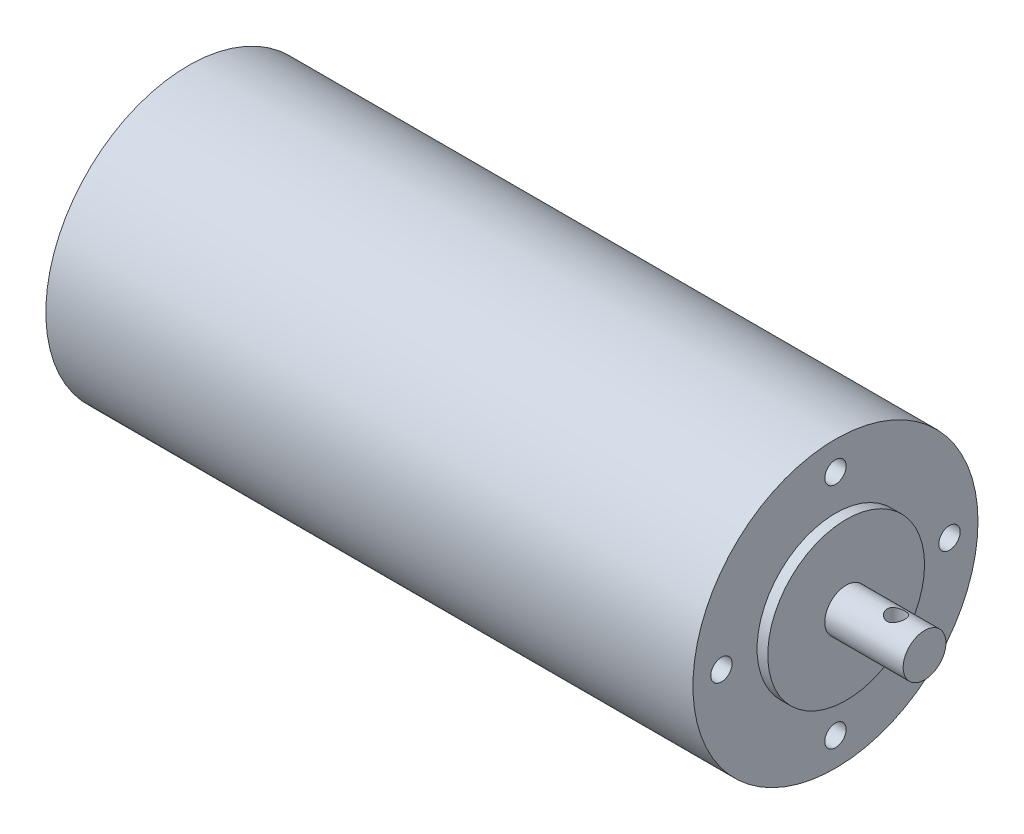
ISO-10303-21;
HEADER;
FILE_DESCRIPTION(('STEP AP214'),'2;1');
FILE_NAME('part.step','',(''),(''),'','','');
FILE_SCHEMA(('AUTOMOTIVE_DESIGN { 1 0 10303 214 1 1 1 1 }'));
ENDSEC;
DATA;
#1=APPLICATION_CONTEXT('core data for automotive mechanical design processes');
#2=APPLICATION_PROTOCOL_DEFINITION('international standard','automotive_design',2000,#1);
#3=PRODUCT_CONTEXT('',#1,'mechanical');
#4=PRODUCT('Part','Part','',(#3));
#5=PRODUCT_RELATED_PRODUCT_CATEGORY('part','',(#4));
#6=PRODUCT_DEFINITION_FORMATION('','',#4);
#7=PRODUCT_DEFINITION_CONTEXT('part definition',#1,'design');
#8=PRODUCT_DEFINITION('design','',#6,#7);
#9=PRODUCT_DEFINITION_SHAPE('','',#8);
#10=(LENGTH_UNIT() NAMED_UNIT(*) SI_UNIT(.MILLI.,.METRE.));
#11=(NAMED_UNIT(*) PLANE_ANGLE_UNIT() SI_UNIT($,.RADIAN.));
#12=(NAMED_UNIT(*) SI_UNIT($,.STERADIAN.) SOLID_ANGLE_UNIT());
#13=UNCERTAINTY_MEASURE_WITH_UNIT(LENGTH_MEASURE(1.E-05),#10,'distance_accuracy_value','');
#14=(GEOMETRIC_REPRESENTATION_CONTEXT(3) GLOBAL_UNCERTAINTY_ASSIGNED_CONTEXT((#13)) GLOBAL_UNIT_ASSIGNED_CONTEXT((#10,
#11,#12)) REPRESENTATION_CONTEXT('',''));
#15=CARTESIAN_POINT('',(0.,0.,0.));
#16=DIRECTION('',(0.,0.,1.));
#17=DIRECTION('',(1.,0.,0.));
#18=AXIS2_PLACEMENT_3D('',#15,#16,#17);
#19=CARTESIAN_POINT('',(90.8,0.,0.));
#20=DIRECTION('',(-1.,0.,0.));
#21=DIRECTION('',(0.,0.,1.));
#22=AXIS2_PLACEMENT_3D('',#19,#20,#21);
#23=CYLINDRICAL_SURFACE('',#22,20.);
#24=CARTESIAN_POINT('',(90.8,0.,0.));
#25=DIRECTION('',(1.,0.,0.));
#26=DIRECTION('',(0.,0.,-1.));
#27=AXIS2_PLACEMENT_3D('',#24,#25,#26);
#28=CIRCLE('',#27,20.);
#29=CARTESIAN_POINT('',(90.8,0.,-20.));
#30=VERTEX_POINT('',#29);
#31=EDGE_CURVE('E53',#30,#30,#28,.T.);
#32=ORIENTED_EDGE('',*,*,#31,.F.);
#33=EDGE_LOOP('',(#32));
#34=FACE_BOUND('',#33,.T.);
#35=CARTESIAN_POINT('',(0.,0.,0.));
#36=DIRECTION('',(1.,0.,0.));
#37=DIRECTION('',(0.,0.,-1.));
#38=AXIS2_PLACEMENT_3D('',#35,#36,#37);
#39=CIRCLE('',#38,20.);
#40=CARTESIAN_POINT('',(0.,0.,-20.));
#41=VERTEX_POINT('',#40);
#42=EDGE_CURVE('E58',#41,#41,#39,.T.);
#43=ORIENTED_EDGE('',*,*,#42,.T.);
#44=EDGE_LOOP('',(#43));
#45=FACE_BOUND('',#44,.T.);
#46=ADVANCED_FACE('F41',(#34,#45),#23,.T.);
#47=CARTESIAN_POINT('',(90.8,0.,0.));
#48=DIRECTION('',(1.,0.,0.));
#49=DIRECTION('',(0.,0.,-1.));
#50=AXIS2_PLACEMENT_3D('',#47,#48,#49);
#51=PLANE('',#50);
#52=CARTESIAN_POINT('',(90.8,16.,0.));
#53=DIRECTION('',(1.,0.,0.));
#54=DIRECTION('',(0.,0.,-1.));
#55=AXIS2_PLACEMENT_3D('',#52,#53,#54);
#56=CIRCLE('',#55,1.5);
#57=CARTESIAN_POINT('',(90.8,16.,-1.5));
#58=VERTEX_POINT('',#57);
#59=EDGE_CURVE('E148',#58,#58,#56,.T.);
#60=ORIENTED_EDGE('',*,*,#59,.F.);
#61=EDGE_LOOP('',(#60));
#62=FACE_BOUND('',#61,.T.);
#63=CARTESIAN_POINT('',(90.8,4.5180819856851E-13,-16.0000000000005));
#64=DIRECTION('',(1.,0.,0.));
#65=DIRECTION('',(0.,0.,-1.));
#66=AXIS2_PLACEMENT_3D('',#63,#64,#65);
#67=CIRCLE('',#66,1.50000000000035);
#68=CARTESIAN_POINT('',(90.8,4.5180819856851E-13,-17.5000000000008));
#69=VERTEX_POINT('',#68);
#70=EDGE_CURVE('E152',#69,#69,#67,.T.);
#71=ORIENTED_EDGE('',*,*,#70,.F.);
#72=EDGE_LOOP('',(#71));
#73=FACE_BOUND('',#72,.T.);
#74=CARTESIAN_POINT('',(90.8,-16.,-9.03616397137021E-13));
#75=DIRECTION('',(1.,0.,0.));
#76=DIRECTION('',(0.,0.,-1.));
#77=AXIS2_PLACEMENT_3D('',#74,#75,#76);
#78=CIRCLE('',#77,1.50000000000097);
#79=CARTESIAN_POINT('',(90.8,-16.,-1.50000000000187));
#80=VERTEX_POINT('',#79);
#81=EDGE_CURVE('E163',#80,#80,#78,.T.);
#82=ORIENTED_EDGE('',*,*,#81,.F.);
#83=EDGE_LOOP('',(#82));
#84=FACE_BOUND('',#83,.T.);
#85=CARTESIAN_POINT('',(90.8,-4.53767633447146E-13,15.9999999999995));
#86=DIRECTION('',(1.,0.,0.));
#87=DIRECTION('',(0.,0.,-1.));
#88=AXIS2_PLACEMENT_3D('',#85,#86,#87);
#89=CIRCLE('',#88,1.50000000000073);
#90=CARTESIAN_POINT('',(90.8,-4.53767633447146E-13,14.4999999999988));
#91=VERTEX_POINT('',#90);
#92=EDGE_CURVE('E169',#91,#91,#89,.T.);
#93=ORIENTED_EDGE('',*,*,#92,.F.);
#94=EDGE_LOOP('',(#93));
#95=FACE_BOUND('',#94,.T.);
#96=CARTESIAN_POINT('',(90.8,0.,0.));
#97=DIRECTION('',(1.,0.,0.));
#98=DIRECTION('',(0.,0.,-1.));
#99=AXIS2_PLACEMENT_3D('',#96,#97,#98);
#100=CIRCLE('',#99,11.);
#101=CARTESIAN_POINT('',(90.8,0.,-11.));
#102=VERTEX_POINT('',#101);
#103=EDGE_CURVE('E10',#102,#102,#100,.T.);
#104=ORIENTED_EDGE('',*,*,#103,.F.);
#105=EDGE_LOOP('',(#104));
#106=FACE_BOUND('',#105,.T.);
#107=ORIENTED_EDGE('',*,*,#31,.T.);
#108=EDGE_LOOP('',(#107));
#109=FACE_BOUND('',#108,.T.);
#110=ADVANCED_FACE('F90',(#62,#73,#84,#95,#106,#109),#51,.T.);
#111=CARTESIAN_POINT('',(0.,0.,0.));
#112=DIRECTION('',(1.,0.,0.));
#113=DIRECTION('',(0.,0.,-1.));
#114=AXIS2_PLACEMENT_3D('',#111,#112,#113);
#115=PLANE('',#114);
#116=ORIENTED_EDGE('',*,*,#42,.F.);
#117=EDGE_LOOP('',(#116));
#118=FACE_BOUND('',#117,.T.);
#119=ADVANCED_FACE('F95',(#118),#115,.F.);
#120=CARTESIAN_POINT('',(92.3,0.,0.));
#121=DIRECTION('',(-1.,0.,0.));
#122=DIRECTION('',(0.,0.,1.));
#123=AXIS2_PLACEMENT_3D('',#120,#121,#122);
#124=CYLINDRICAL_SURFACE('',#123,11.);
#125=CARTESIAN_POINT('',(92.3,0.,0.));
#126=DIRECTION('',(1.,0.,0.));
#127=DIRECTION('',(0.,0.,-1.));
#128=AXIS2_PLACEMENT_3D('',#125,#126,#127);
#129=CIRCLE('',#128,11.);
#130=CARTESIAN_POINT('',(92.3,0.,-11.));
#131=VERTEX_POINT('',#130);
#132=EDGE_CURVE('E61',#131,#131,#129,.T.);
#133=ORIENTED_EDGE('',*,*,#132,.F.);
#134=EDGE_LOOP('',(#133));
#135=FACE_BOUND('',#134,.T.);
#136=ORIENTED_EDGE('',*,*,#103,.T.);
#137=EDGE_LOOP('',(#136));
#138=FACE_BOUND('',#137,.T.);
#139=ADVANCED_FACE('F103',(#135,#138),#124,.T.);
#140=CARTESIAN_POINT('',(92.3,0.,0.));
#141=DIRECTION('',(1.,0.,0.));
#142=DIRECTION('',(0.,0.,-1.));
#143=AXIS2_PLACEMENT_3D('',#140,#141,#142);
#144=PLANE('',#143);
#145=ORIENTED_EDGE('',*,*,#132,.T.);
#146=EDGE_LOOP('',(#145));
#147=FACE_BOUND('',#146,.T.);
#148=CARTESIAN_POINT('',(92.3,0.,0.));
#149=DIRECTION('',(1.,0.,0.));
#150=DIRECTION('',(0.,0.,-1.));
#151=AXIS2_PLACEMENT_3D('',#148,#149,#150);
#152=CIRCLE('',#151,3.);
#153=CARTESIAN_POINT('',(92.3,0.,-3.));
#154=VERTEX_POINT('',#153);
#155=EDGE_CURVE('E70',#154,#154,#152,.T.);
#156=ORIENTED_EDGE('',*,*,#155,.F.);
#157=EDGE_LOOP('',(#156));
#158=FACE_BOUND('',#157,.T.);
#159=ADVANCED_FACE('F107',(#147,#158),#144,.T.);
#160=CARTESIAN_POINT('',(87.6,-4.53767633447146E-13,15.9999999999995));
#161=DIRECTION('',(1.,0.,0.));
#162=DIRECTION('',(0.,0.,-1.));
#163=AXIS2_PLACEMENT_3D('',#160,#161,#162);
#164=CYLINDRICAL_SURFACE('',#163,1.50000000000073);
#165=CARTESIAN_POINT('',(87.6,-4.53767633447146E-13,15.9999999999995));
#166=DIRECTION('',(1.,0.,0.));
#167=DIRECTION('',(0.,0.,-1.));
#168=AXIS2_PLACEMENT_3D('',#165,#166,#167);
#169=CIRCLE('',#168,1.50000000000073);
#170=CARTESIAN_POINT('',(87.6,-4.53767633447146E-13,14.4999999999988));
#171=VERTEX_POINT('',#170);
#172=EDGE_CURVE('E171',#171,#171,#169,.T.);
#173=ORIENTED_EDGE('',*,*,#172,.F.);
#174=EDGE_LOOP('',(#173));
#175=FACE_BOUND('',#174,.T.);
#176=ORIENTED_EDGE('',*,*,#92,.T.);
#177=EDGE_LOOP('',(#176));
#178=FACE_BOUND('',#177,.T.);
#179=ADVANCED_FACE('F113',(#175,#178),#164,.F.);
#180=CARTESIAN_POINT('',(87.6,-4.53767633447146E-13,15.9999999999995));
#181=DIRECTION('',(1.,0.,0.));
#182=DIRECTION('',(0.,0.,-1.));
#183=AXIS2_PLACEMENT_3D('',#180,#181,#182);
#184=PLANE('',#183);
#185=ORIENTED_EDGE('',*,*,#172,.T.);
#186=EDGE_LOOP('',(#185));
#187=FACE_BOUND('',#186,.T.);
#188=ADVANCED_FACE('F115',(#187),#184,.T.);
#189=CARTESIAN_POINT('',(87.6,-16.,-9.03616397137021E-13));
#190=DIRECTION('',(1.,0.,0.));
#191=DIRECTION('',(0.,0.,-1.));
#192=AXIS2_PLACEMENT_3D('',#189,#190,#191);
#193=CYLINDRICAL_SURFACE('',#192,1.50000000000097);
#194=CARTESIAN_POINT('',(87.6,-16.,-9.03616397137021E-13));
#195=DIRECTION('',(1.,0.,0.));
#196=DIRECTION('',(0.,0.,-1.));
#197=AXIS2_PLACEMENT_3D('',#194,#195,#196);
#198=CIRCLE('',#197,1.50000000000097);
#199=CARTESIAN_POINT('',(87.6,-16.,-1.50000000000187));
#200=VERTEX_POINT('',#199);
#201=EDGE_CURVE('E166',#200,#200,#198,.T.);
#202=ORIENTED_EDGE('',*,*,#201,.F.);
#203=EDGE_LOOP('',(#202));
#204=FACE_BOUND('',#203,.T.);
#205=ORIENTED_EDGE('',*,*,#81,.T.);
#206=EDGE_LOOP('',(#205));
#207=FACE_BOUND('',#206,.T.);
#208=ADVANCED_FACE('F118',(#204,#207),#193,.F.);
#209=CARTESIAN_POINT('',(87.6,-16.,-9.03616397137021E-13));
#210=DIRECTION('',(1.,0.,0.));
#211=DIRECTION('',(0.,0.,-1.));
#212=AXIS2_PLACEMENT_3D('',#209,#210,#211);
#213=PLANE('',#212);
#214=ORIENTED_EDGE('',*,*,#201,.T.);
#215=EDGE_LOOP('',(#214));
#216=FACE_BOUND('',#215,.T.);
#217=ADVANCED_FACE('F123',(#216),#213,.T.);
#218=CARTESIAN_POINT('',(87.6,4.5180819856851E-13,-16.0000000000005));
#219=DIRECTION('',(1.,0.,0.));
#220=DIRECTION('',(0.,0.,-1.));
#221=AXIS2_PLACEMENT_3D('',#218,#219,#220);
#222=CYLINDRICAL_SURFACE('',#221,1.50000000000035);
#223=CARTESIAN_POINT('',(87.6,4.5180819856851E-13,-16.0000000000005));
#224=DIRECTION('',(1.,0.,0.));
#225=DIRECTION('',(0.,0.,-1.));
#226=AXIS2_PLACEMENT_3D('',#223,#224,#225);
#227=CIRCLE('',#226,1.50000000000035);
#228=CARTESIAN_POINT('',(87.6,4.5180819856851E-13,-17.5000000000008));
#229=VERTEX_POINT('',#228);
#230=EDGE_CURVE('E160',#229,#229,#227,.T.);
#231=ORIENTED_EDGE('',*,*,#230,.F.);
#232=EDGE_LOOP('',(#231));
#233=FACE_BOUND('',#232,.T.);
#234=ORIENTED_EDGE('',*,*,#70,.T.);
#235=EDGE_LOOP('',(#234));
#236=FACE_BOUND('',#235,.T.);
#237=ADVANCED_FACE('F126',(#233,#236),#222,.F.);
#238=CARTESIAN_POINT('',(87.6,4.5180819856851E-13,-16.0000000000005));
#239=DIRECTION('',(1.,0.,0.));
#240=DIRECTION('',(0.,0.,-1.));
#241=AXIS2_PLACEMENT_3D('',#238,#239,#240);
#242=PLANE('',#241);
#243=ORIENTED_EDGE('',*,*,#230,.T.);
#244=EDGE_LOOP('',(#243));
#245=FACE_BOUND('',#244,.T.);
#246=ADVANCED_FACE('F131',(#245),#242,.T.);
#247=CARTESIAN_POINT('',(87.6,16.,0.));
#248=DIRECTION('',(1.,0.,0.));
#249=DIRECTION('',(0.,0.,-1.));
#250=AXIS2_PLACEMENT_3D('',#247,#248,#249);
#251=CYLINDRICAL_SURFACE('',#250,1.5);
#252=CARTESIAN_POINT('',(87.6,16.,0.));
#253=DIRECTION('',(1.,0.,0.));
#254=DIRECTION('',(0.,0.,-1.));
#255=AXIS2_PLACEMENT_3D('',#252,#253,#254);
#256=CIRCLE('',#255,1.5);
#257=CARTESIAN_POINT('',(87.6,16.,-1.5));
#258=VERTEX_POINT('',#257);
#259=EDGE_CURVE('E147',#258,#258,#256,.T.);
#260=ORIENTED_EDGE('',*,*,#259,.F.);
#261=EDGE_LOOP('',(#260));
#262=FACE_BOUND('',#261,.T.);
#263=ORIENTED_EDGE('',*,*,#59,.T.);
#264=EDGE_LOOP('',(#263));
#265=FACE_BOUND('',#264,.T.);
#266=ADVANCED_FACE('F134',(#262,#265),#251,.F.);
#267=CARTESIAN_POINT('',(87.6,16.,0.));
#268=DIRECTION('',(1.,0.,0.));
#269=DIRECTION('',(0.,0.,-1.));
#270=AXIS2_PLACEMENT_3D('',#267,#268,#269);
#271=PLANE('',#270);
#272=ORIENTED_EDGE('',*,*,#259,.T.);
#273=EDGE_LOOP('',(#272));
#274=FACE_BOUND('',#273,.T.);
#275=ADVANCED_FACE('F79',(#274),#271,.T.);
#276=CARTESIAN_POINT('',(99.3,10.,0.));
#277=DIRECTION('',(0.,-1.,0.));
#278=DIRECTION('',(0.,0.,-1.));
#279=AXIS2_PLACEMENT_3D('',#276,#277,#278);
#280=CYLINDRICAL_SURFACE('',#279,1.25);
#281=CARTESIAN_POINT('',(99.3,-2.72717802865893,-1.25));
#282=CARTESIAN_POINT('',(99.3666718908968,-2.72718519563219,-1.24999259066567));
#283=CARTESIAN_POINT('',(99.4334526568262,-2.729658595344,-1.24463203881503));
#284=CARTESIAN_POINT('',(99.5650869420571,-2.73923833650884,-1.22339678947784));
#285=CARTESIAN_POINT('',(99.6299347266752,-2.74635725824267,-1.20749354003276));
#286=CARTESIAN_POINT('',(99.7555611296911,-2.76426917574768,-1.16589988419451));
#287=CARTESIAN_POINT('',(99.816355163715,-2.77504717562616,-1.14024937431428));
#288=CARTESIAN_POINT('',(99.932759449578,-2.79904148565793,-1.08000637754463));
#289=CARTESIAN_POINT('',(99.9883709234331,-2.81225721880783,-1.04541600591532));
#290=CARTESIAN_POINT('',(100.096325724973,-2.84055762619857,-0.965973882676168));
#291=CARTESIAN_POINT('',(100.148307558744,-2.85570568079146,-0.920653238184409));
#292=CARTESIAN_POINT('',(100.244200222498,-2.88564295372227,-0.822021675745551));
#293=CARTESIAN_POINT('',(100.288107940613,-2.90043203180789,-0.768707691374007));
#294=CARTESIAN_POINT('',(100.368449530879,-2.92875537930613,-0.652763393797353));
#295=CARTESIAN_POINT('',(100.404476628032,-2.94220739975291,-0.589829293683663));
#296=CARTESIAN_POINT('',(100.465276020506,-2.96556519993426,-0.458132022362357));
#297=CARTESIAN_POINT('',(100.490053311964,-2.97547255347157,-0.389371454872128));
#298=CARTESIAN_POINT('',(100.526339458757,-2.99017521042367,-0.251768498025169));
#299=CARTESIAN_POINT('',(100.538471694902,-2.99520971127466,-0.183116576196083));
#300=CARTESIAN_POINT('',(100.55113764116,-3.00046828611204,-0.0445791803650088));
#301=CARTESIAN_POINT('',(100.551676055883,-3.00069431131015,0.0253057817645135));
#302=CARTESIAN_POINT('',(100.541465719067,-2.99645129133057,0.159792780112565));
#303=CARTESIAN_POINT('',(100.531401899474,-2.99226714648664,0.22445748860731));
#304=CARTESIAN_POINT('',(100.501446897362,-2.98006516750309,0.351082893931453));
#305=CARTESIAN_POINT('',(100.48155499037,-2.97204705074577,0.413043391054913));
#306=CARTESIAN_POINT('',(100.432271959105,-2.95279852414029,0.533638118077523));
#307=CARTESIAN_POINT('',(100.402740537129,-2.94152097126085,0.592207177074903));
#308=CARTESIAN_POINT('',(100.3351542433,-2.91685713989805,0.703711767281961));
#309=CARTESIAN_POINT('',(100.297096359155,-2.90347011666255,0.756645297756973));
#310=CARTESIAN_POINT('',(100.210417579595,-2.87481698777061,0.859340911707922));
#311=CARTESIAN_POINT('',(100.161241208721,-2.8594849435601,0.908616437316237));
#312=CARTESIAN_POINT('',(100.055288559293,-2.8293786068147,0.998431414927665));
#313=CARTESIAN_POINT('',(99.9985093617079,-2.8146045313137,1.03896749582431));
#314=CARTESIAN_POINT('',(99.8766049633381,-2.78681612355338,1.11140189250063));
#315=CARTESIAN_POINT('',(99.8112667942567,-2.77387558556714,1.1429725335554));
#316=CARTESIAN_POINT('',(99.6755189550255,-2.75209844221011,1.19446432058391));
#317=CARTESIAN_POINT('',(99.6051129517304,-2.74325890334594,1.21439379627313));
#318=CARTESIAN_POINT('',(99.466103191086,-2.73141212519724,1.24080025168121));
#319=CARTESIAN_POINT('',(99.397678877741,-2.72806369197117,1.24806614632866));
#320=CARTESIAN_POINT('',(99.2605215175885,-2.72660286810642,1.25125630518999));
#321=CARTESIAN_POINT('',(99.1917885858083,-2.72848866599319,1.24718449318149));
#322=CARTESIAN_POINT('',(99.0606016145695,-2.73693131345749,1.22853477565556));
#323=CARTESIAN_POINT('',(98.9980273132132,-2.74318138016617,1.21464618818049));
#324=CARTESIAN_POINT('',(98.8761487035021,-2.75925630297447,1.17767058564226));
#325=CARTESIAN_POINT('',(98.8168451631693,-2.76908199460161,1.15458142053125));
#326=CARTESIAN_POINT('',(98.7003846896435,-2.79170797857,1.09877520805186));
#327=CARTESIAN_POINT('',(98.6434250253897,-2.80461662202282,1.06569183306197));
#328=CARTESIAN_POINT('',(98.535591947501,-2.83180003740794,0.991200784385966));
#329=CARTESIAN_POINT('',(98.4847211832981,-2.84607539920583,0.949789507875985));
#330=CARTESIAN_POINT('',(98.386199865116,-2.87578619784532,0.855844455715504));
#331=CARTESIAN_POINT('',(98.3391486000493,-2.89122146708842,0.802679661479737));
#332=CARTESIAN_POINT('',(98.2545277080207,-2.92043361183923,0.688851512553539));
#333=CARTESIAN_POINT('',(98.2169587759363,-2.93421036577013,0.628187608803659));
#334=CARTESIAN_POINT('',(98.1524101245564,-2.9586425158565,0.50065468080339));
#335=CARTESIAN_POINT('',(98.1254577587105,-2.96928983138826,0.433770169638511));
#336=CARTESIAN_POINT('',(98.0833832076656,-2.98618173103366,0.295858835154421));
#337=CARTESIAN_POINT('',(98.0682539817739,-2.9924289351992,0.224834504225199));
#338=CARTESIAN_POINT('',(98.0511418744797,-2.9995153479751,0.0860165335064144));
#339=CARTESIAN_POINT('',(98.048314000303,-3.00070204534225,0.0183440847939007));
#340=CARTESIAN_POINT('',(98.0536131412939,-2.99849523480953,-0.116486811714282));
#341=CARTESIAN_POINT('',(98.0617382360129,-2.99510252984313,-0.183645347541151));
#342=CARTESIAN_POINT('',(98.0881060721587,-2.98430065981734,-0.313086482449179));
#343=CARTESIAN_POINT('',(98.1059796804695,-2.97703824209233,-0.375457537843563));
#344=CARTESIAN_POINT('',(98.1509342472091,-2.95929499847058,-0.496292230501325));
#345=CARTESIAN_POINT('',(98.1780169546649,-2.94881356124207,-0.554755122985821));
#346=CARTESIAN_POINT('',(98.2419895292145,-2.92505825398663,-0.669024565478777));
#347=CARTESIAN_POINT('',(98.279267301424,-2.91167959188766,-0.724591657976678));
#348=CARTESIAN_POINT('',(98.3620071828719,-2.88371561874231,-0.828918675638779));
#349=CARTESIAN_POINT('',(98.4074723304067,-2.86912986083797,-0.877676061786041));
#350=CARTESIAN_POINT('',(98.5089448258544,-2.83914845259141,-0.97044978723158));
#351=CARTESIAN_POINT('',(98.5654590146211,-2.82376522857896,-1.01391775364847));
#352=CARTESIAN_POINT('',(98.6854587406802,-2.79495552690186,-1.09083332306674));
#353=CARTESIAN_POINT('',(98.7489481480581,-2.78153014522558,-1.12427532456755));
#354=CARTESIAN_POINT('',(98.8809438350227,-2.75842557732643,-1.17982766043577));
#355=CARTESIAN_POINT('',(98.9494211587932,-2.74872654469865,-1.20199823632853));
#356=CARTESIAN_POINT('',(99.0895395738507,-2.73440803066668,-1.23423556453801));
#357=CARTESIAN_POINT('',(99.1611692072743,-2.72977151604981,-1.2443429152121));
#358=CARTESIAN_POINT('',(99.2553585242619,-2.72744979732688,-1.24940464923649));
#359=CARTESIAN_POINT('',(99.277673157388,-2.72717562860875,-1.25000248121118));
#360=CARTESIAN_POINT('',(99.3,-2.72717802865893,-1.25));
#361=B_SPLINE_CURVE_WITH_KNOTS('',3,(#281,#282,#283,#284,#285,#286,#287,#288,#289,#290,#291,
#292,#293,#294,#295,#296,#297,#298,#299,#300,#301,#302,#303,#304,#305,#306,#307,#308,#309,#310,
#311,#312,#313,#314,#315,#316,#317,#318,#319,#320,#321,#322,#323,#324,#325,#326,#327,#328,#329,
#330,#331,#332,#333,#334,#335,#336,#337,#338,#339,#340,#341,#342,#343,#344,#345,#346,#347,#348,
#349,#350,#351,#352,#353,#354,#355,#356,#357,#358,#359,#360),.UNSPECIFIED.,.T.,.F.,(4,2,2,2,2,2,
2,2,2,2,2,2,2,2,2,2,2,2,2,2,2,2,2,2,2,2,2,2,2,2,2,2,2,2,2,2,2,2,2,4),(0.,0.199951711985501,
0.400447161842173,0.600130652152093,0.799766938550099,1.01066841430654,1.22165100459909,
1.44178476577923,1.66182066774891,1.87040605977951,2.0789068091793,2.27471840245092,
2.47054443201883,2.66935814640065,2.86824221022483,3.08114531844484,3.29413040441367,
3.51411545666722,3.73394290745567,3.93950778306305,4.14500152518447,4.3373390106619,
4.5297214691353,4.73025126818169,4.93086800795466,5.14781662735513,5.36478114041866,
5.58230105955594,5.79969134643007,6.00188635094053,6.20404590801914,6.39903415036487,
6.59405944632172,6.79789862829037,7.00181361048903,7.21960426908077,7.43751638139188,
7.65425125796864,7.87025464546162,7.93721375436705),.UNSPECIFIED.);
#362=CARTESIAN_POINT('',(99.3,-2.72717802865893,-1.25));
#363=VERTEX_POINT('',#362);
#364=EDGE_CURVE('E65',#363,#363,#361,.T.);
#365=ORIENTED_EDGE('',*,*,#364,.T.);
#366=EDGE_LOOP('',(#365));
#367=FACE_BOUND('',#366,.T.);
#368=CARTESIAN_POINT('',(99.3,2.72717802865893,-1.25));
#369=CARTESIAN_POINT('',(99.2333281091031,2.72718519563219,-1.24999259066567));
#370=CARTESIAN_POINT('',(99.1665473431738,2.729658595344,-1.24463203881503));
#371=CARTESIAN_POINT('',(99.0349130579428,2.73923833650884,-1.22339678947784));
#372=CARTESIAN_POINT('',(98.9700652733248,2.74635725824267,-1.20749354003276));
#373=CARTESIAN_POINT('',(98.8444388703089,2.76426917574768,-1.1658998841945));
#374=CARTESIAN_POINT('',(98.783644836285,2.77504717562616,-1.14024937431428));
#375=CARTESIAN_POINT('',(98.6672405504219,2.79904148565793,-1.08000637754462));
#376=CARTESIAN_POINT('',(98.6116290765669,2.81225721880783,-1.04541600591531));
#377=CARTESIAN_POINT('',(98.5036742750265,2.84055762619857,-0.965973882676167));
#378=CARTESIAN_POINT('',(98.4516924412559,2.85570568079146,-0.920653238184409));
#379=CARTESIAN_POINT('',(98.3557997775024,2.88564295372227,-0.822021675745551));
#380=CARTESIAN_POINT('',(98.311892059387,2.90043203180789,-0.768707691374007));
#381=CARTESIAN_POINT('',(98.2315504691207,2.92875537930613,-0.652763393797353));
#382=CARTESIAN_POINT('',(98.1955233719676,2.94220739975291,-0.589829293683663));
#383=CARTESIAN_POINT('',(98.1347239794944,2.96556519993426,-0.458132022362357));
#384=CARTESIAN_POINT('',(98.1099466880358,2.97547255347157,-0.389371454872128));
#385=CARTESIAN_POINT('',(98.0736605412433,2.99017521042367,-0.251768498025168));
#386=CARTESIAN_POINT('',(98.0615283050979,2.99520971127466,-0.183116576196083));
#387=CARTESIAN_POINT('',(98.0488623588401,3.00046828611204,-0.044579180365008));
#388=CARTESIAN_POINT('',(98.048323944117,3.00069431131015,0.025305781764514));
#389=CARTESIAN_POINT('',(98.0585342809333,2.99645129133057,0.159792780112565));
#390=CARTESIAN_POINT('',(98.0685981005257,2.99226714648664,0.22445748860731));
#391=CARTESIAN_POINT('',(98.0985531026381,2.98006516750309,0.351082893931453));
#392=CARTESIAN_POINT('',(98.1184450096302,2.97204705074577,0.413043391054913));
#393=CARTESIAN_POINT('',(98.1677280408946,2.95279852414029,0.533638118077523));
#394=CARTESIAN_POINT('',(98.1972594628708,2.94152097126085,0.592207177074903));
#395=CARTESIAN_POINT('',(98.2648457567003,2.91685713989805,0.703711767281961));
#396=CARTESIAN_POINT('',(98.302903640845,2.90347011666255,0.756645297756973));
#397=CARTESIAN_POINT('',(98.3895824204046,2.87481698777061,0.859340911707922));
#398=CARTESIAN_POINT('',(98.438758791279,2.8594849435601,0.908616437316237));
#399=CARTESIAN_POINT('',(98.5447114407066,2.8293786068147,0.998431414927665));
#400=CARTESIAN_POINT('',(98.6014906382921,2.8146045313137,1.03896749582431));
#401=CARTESIAN_POINT('',(98.7233950366619,2.78681612355338,1.11140189250063));
#402=CARTESIAN_POINT('',(98.7887332057433,2.77387558556714,1.1429725335554));
#403=CARTESIAN_POINT('',(98.9244810449745,2.75209844221011,1.19446432058391));
#404=CARTESIAN_POINT('',(98.9948870482695,2.74325890334594,1.21439379627313));
#405=CARTESIAN_POINT('',(99.133896808914,2.73141212519724,1.24080025168121));
#406=CARTESIAN_POINT('',(99.202321122259,2.72806369197117,1.24806614632866));
#407=CARTESIAN_POINT('',(99.3394784824115,2.72660286810642,1.25125630518999));
#408=CARTESIAN_POINT('',(99.4082114141917,2.72848866599319,1.24718449318149));
#409=CARTESIAN_POINT('',(99.5393983854304,2.73693131345749,1.22853477565556));
#410=CARTESIAN_POINT('',(99.6019726867868,2.74318138016618,1.21464618818048));
#411=CARTESIAN_POINT('',(99.7238512964979,2.75925630297447,1.17767058564225));
#412=CARTESIAN_POINT('',(99.7831548368307,2.76908199460161,1.15458142053125));
#413=CARTESIAN_POINT('',(99.8996153103565,2.79170797857,1.09877520805186));
#414=CARTESIAN_POINT('',(99.9565749746103,2.80461662202282,1.06569183306198));
#415=CARTESIAN_POINT('',(100.064408052499,2.83180003740794,0.99120078438597));
#416=CARTESIAN_POINT('',(100.115278816702,2.84607539920583,0.949789507875988));
#417=CARTESIAN_POINT('',(100.213800134884,2.87578619784532,0.855844455715505));
#418=CARTESIAN_POINT('',(100.260851399951,2.89122146708842,0.802679661479737));
#419=CARTESIAN_POINT('',(100.345472291979,2.92043361183923,0.688851512553539));
#420=CARTESIAN_POINT('',(100.383041224064,2.93421036577013,0.628187608803659));
#421=CARTESIAN_POINT('',(100.447589875444,2.9586425158565,0.50065468080339));
#422=CARTESIAN_POINT('',(100.474542241289,2.96928983138826,0.433770169638511));
#423=CARTESIAN_POINT('',(100.516616792334,2.98618173103366,0.295858835154421));
#424=CARTESIAN_POINT('',(100.531746018226,2.9924289351992,0.224834504225199));
#425=CARTESIAN_POINT('',(100.54885812552,2.9995153479751,0.0860165335064144));
#426=CARTESIAN_POINT('',(100.551685999697,3.00070204534225,0.0183440847939007));
#427=CARTESIAN_POINT('',(100.546386858706,2.99849523480953,-0.116486811714282));
#428=CARTESIAN_POINT('',(100.538261763987,2.99510252984313,-0.183645347541151));
#429=CARTESIAN_POINT('',(100.511893927841,2.98430065981734,-0.313086482449179));
#430=CARTESIAN_POINT('',(100.49402031953,2.97703824209233,-0.375457537843563));
#431=CARTESIAN_POINT('',(100.449065752791,2.95929499847058,-0.496292230501325));
#432=CARTESIAN_POINT('',(100.421983045335,2.94881356124207,-0.554755122985821));
#433=CARTESIAN_POINT('',(100.358010470786,2.92505825398663,-0.669024565478777));
#434=CARTESIAN_POINT('',(100.320732698576,2.91167959188766,-0.724591657976678));
#435=CARTESIAN_POINT('',(100.237992817128,2.88371561874231,-0.828918675638779));
#436=CARTESIAN_POINT('',(100.192527669593,2.86912986083797,-0.877676061786041));
#437=CARTESIAN_POINT('',(100.091055174146,2.83914845259141,-0.97044978723158));
#438=CARTESIAN_POINT('',(100.034540985379,2.82376522857896,-1.01391775364847));
#439=CARTESIAN_POINT('',(99.9145412593198,2.79495552690186,-1.09083332306674));
#440=CARTESIAN_POINT('',(99.8510518519418,2.78153014522558,-1.12427532456755));
#441=CARTESIAN_POINT('',(99.7190561649772,2.75842557732643,-1.17982766043577));
#442=CARTESIAN_POINT('',(99.6505788412068,2.74872654469865,-1.20199823632853));
#443=CARTESIAN_POINT('',(99.5104604261493,2.73440803066668,-1.23423556453801));
#444=CARTESIAN_POINT('',(99.4388307927257,2.72977151604981,-1.2443429152121));
#445=CARTESIAN_POINT('',(99.3446414757381,2.72744979732688,-1.24940464923649));
#446=CARTESIAN_POINT('',(99.322326842612,2.72717562860875,-1.25000248121118));
#447=CARTESIAN_POINT('',(99.3,2.72717802865893,-1.25));
#448=B_SPLINE_CURVE_WITH_KNOTS('',3,(#368,#369,#370,#371,#372,#373,#374,#375,#376,#377,#378,
#379,#380,#381,#382,#383,#384,#385,#386,#387,#388,#389,#390,#391,#392,#393,#394,#395,#396,#397,
#398,#399,#400,#401,#402,#403,#404,#405,#406,#407,#408,#409,#410,#411,#412,#413,#414,#415,#416,
#417,#418,#419,#420,#421,#422,#423,#424,#425,#426,#427,#428,#429,#430,#431,#432,#433,#434,#435,
#436,#437,#438,#439,#440,#441,#442,#443,#444,#445,#446,#447),.UNSPECIFIED.,.T.,.F.,(4,2,2,2,2,2,
2,2,2,2,2,2,2,2,2,2,2,2,2,2,2,2,2,2,2,2,2,2,2,2,2,2,2,2,2,2,2,2,2,4),(0.,0.199951711985501,
0.400447161842173,0.600130652152123,0.799766938550099,1.01066841430654,1.22165100459909,
1.44178476577923,1.66182066774891,1.87040605977952,2.0789068091793,2.27471840245092,
2.47054443201883,2.66935814640065,2.86824221022483,3.08114531844484,3.29413040441367,
3.51411545666722,3.73394290745567,3.93950778306305,4.14500152518447,4.33733901066192,
4.5297214691353,4.73025126818168,4.93086800795466,5.14781662735513,5.36478114041866,
5.58230105955594,5.79969134643007,6.00188635094053,6.20404590801914,6.39903415036487,
6.59405944632172,6.79789862829037,7.00181361048903,7.21960426908077,7.43751638139188,
7.65425125796864,7.87025464546162,7.93721375436705),.UNSPECIFIED.);
#449=CARTESIAN_POINT('',(99.3,2.72717802865893,-1.25));
#450=VERTEX_POINT('',#449);
#451=EDGE_CURVE('E44',#450,#450,#448,.T.);
#452=ORIENTED_EDGE('',*,*,#451,.T.);
#453=EDGE_LOOP('',(#452));
#454=FACE_BOUND('',#453,.T.);
#455=ADVANCED_FACE('F75',(#367,#454),#280,.F.);
#456=CARTESIAN_POINT('',(103.3,0.,0.));
#457=DIRECTION('',(1.,0.,0.));
#458=DIRECTION('',(0.,0.,-1.));
#459=AXIS2_PLACEMENT_3D('',#456,#457,#458);
#460=PLANE('',#459);
#461=CARTESIAN_POINT('',(103.3,0.,0.));
#462=DIRECTION('',(1.,0.,0.));
#463=DIRECTION('',(0.,0.,-1.));
#464=AXIS2_PLACEMENT_3D('',#461,#462,#463);
#465=CIRCLE('',#464,3.);
#466=CARTESIAN_POINT('',(103.3,0.,-3.));
#467=VERTEX_POINT('',#466);
#468=EDGE_CURVE('E155',#467,#467,#465,.T.);
#469=ORIENTED_EDGE('',*,*,#468,.T.);
#470=EDGE_LOOP('',(#469));
#471=FACE_BOUND('',#470,.T.);
#472=ADVANCED_FACE('F78',(#471),#460,.T.);
#473=CARTESIAN_POINT('',(103.3,0.,0.));
#474=DIRECTION('',(-1.,0.,0.));
#475=DIRECTION('',(0.,0.,1.));
#476=AXIS2_PLACEMENT_3D('',#473,#474,#475);
#477=CYLINDRICAL_SURFACE('',#476,3.);
#478=ORIENTED_EDGE('',*,*,#155,.T.);
#479=EDGE_LOOP('',(#478));
#480=FACE_BOUND('',#479,.T.);
#481=ORIENTED_EDGE('',*,*,#468,.F.);
#482=EDGE_LOOP('',(#481));
#483=FACE_BOUND('',#482,.T.);
#484=ORIENTED_EDGE('',*,*,#364,.F.);
#485=EDGE_LOOP('',(#484));
#486=FACE_BOUND('',#485,.T.);
#487=ORIENTED_EDGE('',*,*,#451,.F.);
#488=EDGE_LOOP('',(#487));
#489=FACE_BOUND('',#488,.T.);
#490=ADVANCED_FACE('F71',(#480,#483,#486,#489),#477,.T.);
#491=CLOSED_SHELL('',(#46,#110,#119,#139,#159,#179,#188,#208,#217,#237,#246,#266,#275,#455,#472,#490));
#492=MANIFOLD_SOLID_BREP('B2',#491);
#493=ADVANCED_BREP_SHAPE_REPRESENTATION('',(#18,#492),#14);
#494=SHAPE_DEFINITION_REPRESENTATION(#9,#493);
ENDSEC;
END-ISO-10303-21;
